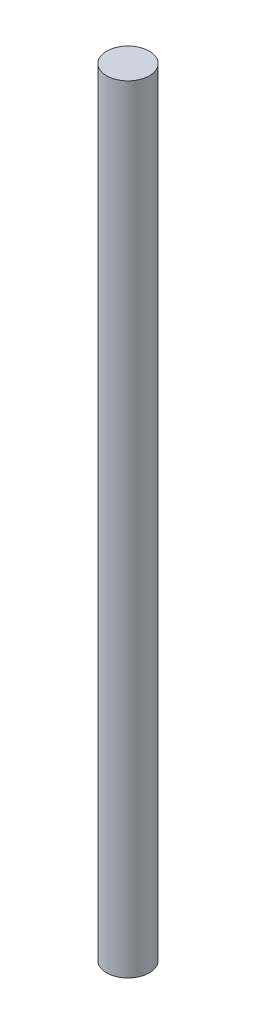
ISO-10303-21;
HEADER;
FILE_DESCRIPTION(('STEP AP214'),'2;1');
FILE_NAME('part.step','',(''),(''),'','','');
FILE_SCHEMA(('AUTOMOTIVE_DESIGN { 1 0 10303 214 1 1 1 1 }'));
ENDSEC;
DATA;
#1=APPLICATION_CONTEXT('core data for automotive mechanical design processes');
#2=APPLICATION_PROTOCOL_DEFINITION('international standard','automotive_design',2000,#1);
#3=PRODUCT_CONTEXT('',#1,'mechanical');
#4=PRODUCT('Part','Part','',(#3));
#5=PRODUCT_RELATED_PRODUCT_CATEGORY('part','',(#4));
#6=PRODUCT_DEFINITION_FORMATION('','',#4);
#7=PRODUCT_DEFINITION_CONTEXT('part definition',#1,'design');
#8=PRODUCT_DEFINITION('design','',#6,#7);
#9=PRODUCT_DEFINITION_SHAPE('','',#8);
#10=(LENGTH_UNIT() NAMED_UNIT(*) SI_UNIT(.MILLI.,.METRE.));
#11=(NAMED_UNIT(*) PLANE_ANGLE_UNIT() SI_UNIT($,.RADIAN.));
#12=(NAMED_UNIT(*) SI_UNIT($,.STERADIAN.) SOLID_ANGLE_UNIT());
#13=UNCERTAINTY_MEASURE_WITH_UNIT(LENGTH_MEASURE(1.E-05),#10,'distance_accuracy_value','');
#14=(GEOMETRIC_REPRESENTATION_CONTEXT(3) GLOBAL_UNCERTAINTY_ASSIGNED_CONTEXT((#13)) GLOBAL_UNIT_ASSIGNED_CONTEXT((#10,
#11,#12)) REPRESENTATION_CONTEXT('',''));
#15=CARTESIAN_POINT('',(0.,0.,0.));
#16=DIRECTION('',(0.,0.,1.));
#17=DIRECTION('',(1.,0.,0.));
#18=AXIS2_PLACEMENT_3D('',#15,#16,#17);
#19=CARTESIAN_POINT('',(0.,400.,0.));
#20=DIRECTION('',(0.,-1.,0.));
#21=DIRECTION('',(0.,0.,-1.));
#22=AXIS2_PLACEMENT_3D('',#19,#20,#21);
#23=CYLINDRICAL_SURFACE('',#22,11.);
#24=CARTESIAN_POINT('',(0.,400.,0.));
#25=DIRECTION('',(0.,1.,0.));
#26=DIRECTION('',(0.,0.,1.));
#27=AXIS2_PLACEMENT_3D('',#24,#25,#26);
#28=CIRCLE('',#27,11.);
#29=CARTESIAN_POINT('',(0.,400.,11.));
#30=VERTEX_POINT('',#29);
#31=EDGE_CURVE('E10',#30,#30,#28,.T.);
#32=ORIENTED_EDGE('',*,*,#31,.F.);
#33=EDGE_LOOP('',(#32));
#34=FACE_BOUND('',#33,.T.);
#35=CARTESIAN_POINT('',(0.,0.,0.));
#36=DIRECTION('',(0.,1.,0.));
#37=DIRECTION('',(0.,0.,1.));
#38=AXIS2_PLACEMENT_3D('',#35,#36,#37);
#39=CIRCLE('',#38,11.);
#40=CARTESIAN_POINT('',(0.,0.,11.));
#41=VERTEX_POINT('',#40);
#42=EDGE_CURVE('E46',#41,#41,#39,.T.);
#43=ORIENTED_EDGE('',*,*,#42,.T.);
#44=EDGE_LOOP('',(#43));
#45=FACE_BOUND('',#44,.T.);
#46=ADVANCED_FACE('F43',(#34,#45),#23,.T.);
#47=CARTESIAN_POINT('',(0.,400.,0.));
#48=DIRECTION('',(0.,1.,0.));
#49=DIRECTION('',(0.,0.,1.));
#50=AXIS2_PLACEMENT_3D('',#47,#48,#49);
#51=PLANE('',#50);
#52=ORIENTED_EDGE('',*,*,#31,.T.);
#53=EDGE_LOOP('',(#52));
#54=FACE_BOUND('',#53,.T.);
#55=ADVANCED_FACE('F60',(#54),#51,.T.);
#56=CARTESIAN_POINT('',(0.,0.,0.));
#57=DIRECTION('',(0.,1.,0.));
#58=DIRECTION('',(0.,0.,1.));
#59=AXIS2_PLACEMENT_3D('',#56,#57,#58);
#60=PLANE('',#59);
#61=ORIENTED_EDGE('',*,*,#42,.F.);
#62=EDGE_LOOP('',(#61));
#63=FACE_BOUND('',#62,.T.);
#64=ADVANCED_FACE('F58',(#63),#60,.F.);
#65=CLOSED_SHELL('',(#46,#55,#64));
#66=MANIFOLD_SOLID_BREP('B2',#65);
#67=ADVANCED_BREP_SHAPE_REPRESENTATION('',(#18,#66),#14);
#68=SHAPE_DEFINITION_REPRESENTATION(#9,#67);
ENDSEC;
END-ISO-10303-21;
